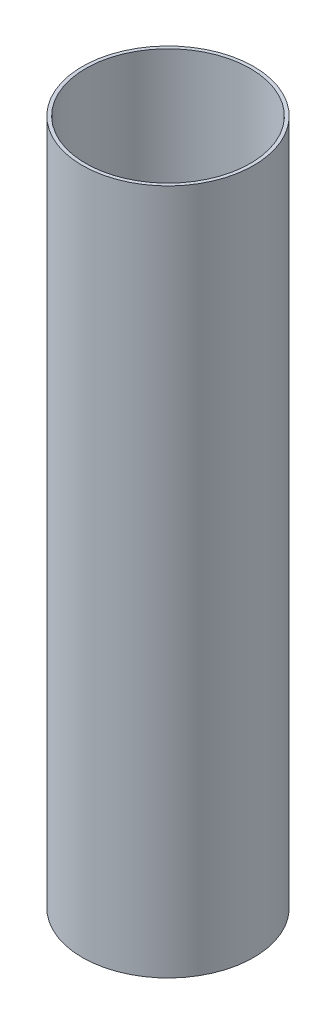
ISO-10303-21;
HEADER;
FILE_DESCRIPTION(('STEP AP214'),'2;1');
FILE_NAME('part.step','',(''),(''),'','','');
FILE_SCHEMA(('AUTOMOTIVE_DESIGN { 1 0 10303 214 1 1 1 1 }'));
ENDSEC;
DATA;
#1=APPLICATION_CONTEXT('core data for automotive mechanical design processes');
#2=APPLICATION_PROTOCOL_DEFINITION('international standard','automotive_design',2000,#1);
#3=PRODUCT_CONTEXT('',#1,'mechanical');
#4=PRODUCT('Part','Part','',(#3));
#5=PRODUCT_RELATED_PRODUCT_CATEGORY('part','',(#4));
#6=PRODUCT_DEFINITION_FORMATION('','',#4);
#7=PRODUCT_DEFINITION_CONTEXT('part definition',#1,'design');
#8=PRODUCT_DEFINITION('design','',#6,#7);
#9=PRODUCT_DEFINITION_SHAPE('','',#8);
#10=(LENGTH_UNIT() NAMED_UNIT(*) SI_UNIT(.MILLI.,.METRE.));
#11=(NAMED_UNIT(*) PLANE_ANGLE_UNIT() SI_UNIT($,.RADIAN.));
#12=(NAMED_UNIT(*) SI_UNIT($,.STERADIAN.) SOLID_ANGLE_UNIT());
#13=UNCERTAINTY_MEASURE_WITH_UNIT(LENGTH_MEASURE(1.E-05),#10,'distance_accuracy_value','');
#14=(GEOMETRIC_REPRESENTATION_CONTEXT(3) GLOBAL_UNCERTAINTY_ASSIGNED_CONTEXT((#13)) GLOBAL_UNIT_ASSIGNED_CONTEXT((#10,
#11,#12)) REPRESENTATION_CONTEXT('',''));
#15=CARTESIAN_POINT('',(0.,0.,0.));
#16=DIRECTION('',(0.,0.,1.));
#17=DIRECTION('',(1.,0.,0.));
#18=AXIS2_PLACEMENT_3D('',#15,#16,#17);
#19=CARTESIAN_POINT('',(0.,158.75,0.));
#20=DIRECTION('',(0.,1.,0.));
#21=DIRECTION('',(0.,0.,1.));
#22=AXIS2_PLACEMENT_3D('',#19,#20,#21);
#23=PLANE('',#22);
#24=CARTESIAN_POINT('',(0.,158.75,0.));
#25=DIRECTION('',(0.,1.,0.));
#26=DIRECTION('',(0.,0.,1.));
#27=AXIS2_PLACEMENT_3D('',#24,#25,#26);
#28=CIRCLE('',#27,39.6748);
#29=CARTESIAN_POINT('',(0.,158.75,-39.6748));
#30=VERTEX_POINT('',#29);
#31=EDGE_CURVE('E10',#30,#30,#28,.T.);
#32=ORIENTED_EDGE('',*,*,#31,.T.);
#33=EDGE_LOOP('',(#32));
#34=FACE_BOUND('',#33,.T.);
#35=CARTESIAN_POINT('',(0.,158.75,0.));
#36=DIRECTION('',(0.,1.,0.));
#37=DIRECTION('',(0.,0.,1.));
#38=AXIS2_PLACEMENT_3D('',#35,#36,#37);
#39=CIRCLE('',#38,38.1);
#40=CARTESIAN_POINT('',(0.,158.75,-38.1));
#41=VERTEX_POINT('',#40);
#42=EDGE_CURVE('E54',#41,#41,#39,.T.);
#43=ORIENTED_EDGE('',*,*,#42,.F.);
#44=EDGE_LOOP('',(#43));
#45=FACE_BOUND('',#44,.T.);
#46=ADVANCED_FACE('F41',(#34,#45),#23,.T.);
#47=CARTESIAN_POINT('',(0.,-158.75,0.));
#48=DIRECTION('',(0.,1.,0.));
#49=DIRECTION('',(0.,0.,1.));
#50=AXIS2_PLACEMENT_3D('',#47,#48,#49);
#51=PLANE('',#50);
#52=CARTESIAN_POINT('',(0.,-158.75,0.));
#53=DIRECTION('',(0.,1.,0.));
#54=DIRECTION('',(0.,0.,1.));
#55=AXIS2_PLACEMENT_3D('',#52,#53,#54);
#56=CIRCLE('',#55,39.6748);
#57=CARTESIAN_POINT('',(0.,-158.75,-39.6748));
#58=VERTEX_POINT('',#57);
#59=EDGE_CURVE('E45',#58,#58,#56,.T.);
#60=ORIENTED_EDGE('',*,*,#59,.F.);
#61=EDGE_LOOP('',(#60));
#62=FACE_BOUND('',#61,.T.);
#63=CARTESIAN_POINT('',(0.,-158.75,0.));
#64=DIRECTION('',(0.,1.,0.));
#65=DIRECTION('',(0.,0.,1.));
#66=AXIS2_PLACEMENT_3D('',#63,#64,#65);
#67=CIRCLE('',#66,38.1);
#68=CARTESIAN_POINT('',(0.,-158.75,-38.1));
#69=VERTEX_POINT('',#68);
#70=EDGE_CURVE('E56',#69,#69,#67,.T.);
#71=ORIENTED_EDGE('',*,*,#70,.T.);
#72=EDGE_LOOP('',(#71));
#73=FACE_BOUND('',#72,.T.);
#74=ADVANCED_FACE('F68',(#62,#73),#51,.F.);
#75=CARTESIAN_POINT('',(0.,158.75,0.));
#76=DIRECTION('',(0.,-1.,0.));
#77=DIRECTION('',(0.,0.,-1.));
#78=AXIS2_PLACEMENT_3D('',#75,#76,#77);
#79=CYLINDRICAL_SURFACE('',#78,39.6748);
#80=CARTESIAN_POINT('',(0.,158.75,-39.6748));
#81=CARTESIAN_POINT('',(0.,155.442708333333,-39.6748));
#82=CARTESIAN_POINT('',(0.,152.135416666667,-39.6748));
#83=CARTESIAN_POINT('',(0.,145.520833333333,-39.6748));
#84=CARTESIAN_POINT('',(0.,142.213541666667,-39.6748));
#85=CARTESIAN_POINT('',(0.,135.598958333333,-39.6748));
#86=CARTESIAN_POINT('',(0.,132.291666666667,-39.6748));
#87=CARTESIAN_POINT('',(0.,125.677083333333,-39.6748));
#88=CARTESIAN_POINT('',(0.,122.369791666667,-39.6748));
#89=CARTESIAN_POINT('',(0.,115.755208333333,-39.6748));
#90=CARTESIAN_POINT('',(0.,112.447916666667,-39.6748));
#91=CARTESIAN_POINT('',(0.,105.833333333333,-39.6748));
#92=CARTESIAN_POINT('',(0.,102.526041666667,-39.6748));
#93=CARTESIAN_POINT('',(0.,95.9114583333333,-39.6748));
#94=CARTESIAN_POINT('',(0.,92.6041666666666,-39.6748));
#95=CARTESIAN_POINT('',(0.,85.9895833333333,-39.6748));
#96=CARTESIAN_POINT('',(0.,82.6822916666666,-39.6748));
#97=CARTESIAN_POINT('',(0.,76.0677083333333,-39.6748));
#98=CARTESIAN_POINT('',(0.,72.7604166666666,-39.6748));
#99=CARTESIAN_POINT('',(0.,66.1458333333333,-39.6748));
#100=CARTESIAN_POINT('',(0.,62.8385416666666,-39.6748));
#101=CARTESIAN_POINT('',(0.,56.2239583333333,-39.6748));
#102=CARTESIAN_POINT('',(0.,52.9166666666666,-39.6748));
#103=CARTESIAN_POINT('',(0.,46.3020833333333,-39.6748));
#104=CARTESIAN_POINT('',(0.,42.9947916666666,-39.6748));
#105=CARTESIAN_POINT('',(0.,36.3802083333333,-39.6748));
#106=CARTESIAN_POINT('',(0.,33.0729166666666,-39.6748));
#107=CARTESIAN_POINT('',(0.,26.4583333333333,-39.6748));
#108=CARTESIAN_POINT('',(0.,23.1510416666666,-39.6748));
#109=CARTESIAN_POINT('',(0.,16.5364583333333,-39.6748));
#110=CARTESIAN_POINT('',(0.,13.2291666666666,-39.6748));
#111=CARTESIAN_POINT('',(0.,6.6145833333333,-39.6748));
#112=CARTESIAN_POINT('',(0.,3.30729166666664,-39.6748));
#113=CARTESIAN_POINT('',(0.,-3.30729166666669,-39.6748));
#114=CARTESIAN_POINT('',(0.,-6.61458333333336,-39.6748));
#115=CARTESIAN_POINT('',(0.,-13.2291666666667,-39.6748));
#116=CARTESIAN_POINT('',(0.,-16.5364583333334,-39.6748));
#117=CARTESIAN_POINT('',(0.,-23.1510416666667,-39.6748));
#118=CARTESIAN_POINT('',(0.,-26.4583333333334,-39.6748));
#119=CARTESIAN_POINT('',(0.,-33.0729166666667,-39.6748));
#120=CARTESIAN_POINT('',(0.,-36.3802083333334,-39.6748));
#121=CARTESIAN_POINT('',(0.,-42.9947916666667,-39.6748));
#122=CARTESIAN_POINT('',(0.,-46.3020833333334,-39.6748));
#123=CARTESIAN_POINT('',(0.,-52.9166666666667,-39.6748));
#124=CARTESIAN_POINT('',(0.,-56.2239583333334,-39.6748));
#125=CARTESIAN_POINT('',(0.,-62.8385416666667,-39.6748));
#126=CARTESIAN_POINT('',(0.,-66.1458333333334,-39.6748));
#127=CARTESIAN_POINT('',(0.,-72.7604166666667,-39.6748));
#128=CARTESIAN_POINT('',(0.,-76.0677083333334,-39.6748));
#129=CARTESIAN_POINT('',(0.,-82.6822916666667,-39.6748));
#130=CARTESIAN_POINT('',(0.,-85.9895833333334,-39.6748));
#131=CARTESIAN_POINT('',(0.,-92.6041666666667,-39.6748));
#132=CARTESIAN_POINT('',(0.,-95.9114583333334,-39.6748));
#133=CARTESIAN_POINT('',(0.,-102.526041666667,-39.6748));
#134=CARTESIAN_POINT('',(0.,-105.833333333333,-39.6748));
#135=CARTESIAN_POINT('',(0.,-112.447916666667,-39.6748));
#136=CARTESIAN_POINT('',(0.,-115.755208333333,-39.6748));
#137=CARTESIAN_POINT('',(0.,-122.369791666667,-39.6748));
#138=CARTESIAN_POINT('',(0.,-125.677083333333,-39.6748));
#139=CARTESIAN_POINT('',(0.,-132.291666666667,-39.6748));
#140=CARTESIAN_POINT('',(0.,-135.598958333333,-39.6748));
#141=CARTESIAN_POINT('',(0.,-142.213541666667,-39.6748));
#142=CARTESIAN_POINT('',(0.,-145.520833333333,-39.6748));
#143=CARTESIAN_POINT('',(0.,-152.135416666667,-39.6748));
#144=CARTESIAN_POINT('',(0.,-155.442708333333,-39.6748));
#145=CARTESIAN_POINT('',(0.,-158.75,-39.6748));
#146=B_SPLINE_CURVE_WITH_KNOTS('',3,(#80,#81,#82,#83,#84,#85,#86,#87,#88,#89,#90,#91,#92,#93,
#94,#95,#96,#97,#98,#99,#100,#101,#102,#103,#104,#105,#106,#107,#108,#109,#110,#111,#112,#113,
#114,#115,#116,#117,#118,#119,#120,#121,#122,#123,#124,#125,#126,#127,#128,#129,#130,#131,#132,
#133,#134,#135,#136,#137,#138,#139,#140,#141,#142,#143,#144,#145),.UNSPECIFIED.,.F.,.F.,(4,2,2,
2,2,2,2,2,2,2,2,2,2,2,2,2,2,2,2,2,2,2,2,2,2,2,2,2,2,2,2,2,4),(0.,9.92187500000002,19.84375,
29.765625,39.6875,49.609375,59.53125,69.453125,79.375,89.296875,99.21875,109.140625,119.0625,
128.984375,138.90625,148.828125,158.75,168.671875,178.59375,188.515625,198.4375,208.359375,
218.28125,228.203125,238.125,248.046875,257.96875,267.890625,277.8125,287.734375,297.65625,
307.578125,317.5),.UNSPECIFIED.);
#147=EDGE_CURVE('BSEAM43',#30,#58,#146,.T.);
#148=ORIENTED_EDGE('',*,*,#31,.F.);
#149=ORIENTED_EDGE('',*,*,#59,.T.);
#150=ORIENTED_EDGE('',*,*,#147,.T.);
#151=ORIENTED_EDGE('',*,*,#147,.F.);
#152=EDGE_LOOP('',(#148,#150,#149,#151));
#153=FACE_BOUND('',#152,.T.);
#154=ADVANCED_FACE('F43',(#153),#79,.T.);
#155=CARTESIAN_POINT('',(0.,158.75,0.));
#156=DIRECTION('',(0.,-1.,0.));
#157=DIRECTION('',(0.,0.,-1.));
#158=AXIS2_PLACEMENT_3D('',#155,#156,#157);
#159=CYLINDRICAL_SURFACE('',#158,38.1);
#160=CARTESIAN_POINT('',(0.,158.75,-38.1));
#161=CARTESIAN_POINT('',(0.,155.442708333333,-38.1));
#162=CARTESIAN_POINT('',(0.,152.135416666667,-38.1));
#163=CARTESIAN_POINT('',(0.,145.520833333333,-38.1));
#164=CARTESIAN_POINT('',(0.,142.213541666667,-38.1));
#165=CARTESIAN_POINT('',(0.,135.598958333333,-38.1));
#166=CARTESIAN_POINT('',(0.,132.291666666667,-38.1));
#167=CARTESIAN_POINT('',(0.,125.677083333333,-38.1));
#168=CARTESIAN_POINT('',(0.,122.369791666667,-38.1));
#169=CARTESIAN_POINT('',(0.,115.755208333333,-38.1));
#170=CARTESIAN_POINT('',(0.,112.447916666667,-38.1));
#171=CARTESIAN_POINT('',(0.,105.833333333333,-38.1));
#172=CARTESIAN_POINT('',(0.,102.526041666667,-38.1));
#173=CARTESIAN_POINT('',(0.,95.9114583333333,-38.1));
#174=CARTESIAN_POINT('',(0.,92.6041666666666,-38.1));
#175=CARTESIAN_POINT('',(0.,85.9895833333333,-38.1));
#176=CARTESIAN_POINT('',(0.,82.6822916666666,-38.1));
#177=CARTESIAN_POINT('',(0.,76.0677083333333,-38.1));
#178=CARTESIAN_POINT('',(0.,72.7604166666666,-38.1));
#179=CARTESIAN_POINT('',(0.,66.1458333333333,-38.1));
#180=CARTESIAN_POINT('',(0.,62.8385416666666,-38.1));
#181=CARTESIAN_POINT('',(0.,56.2239583333333,-38.1));
#182=CARTESIAN_POINT('',(0.,52.9166666666666,-38.1));
#183=CARTESIAN_POINT('',(0.,46.3020833333333,-38.1));
#184=CARTESIAN_POINT('',(0.,42.9947916666666,-38.1));
#185=CARTESIAN_POINT('',(0.,36.3802083333333,-38.1));
#186=CARTESIAN_POINT('',(0.,33.0729166666666,-38.1));
#187=CARTESIAN_POINT('',(0.,26.4583333333333,-38.1));
#188=CARTESIAN_POINT('',(0.,23.1510416666666,-38.1));
#189=CARTESIAN_POINT('',(0.,16.5364583333333,-38.1));
#190=CARTESIAN_POINT('',(0.,13.2291666666666,-38.1));
#191=CARTESIAN_POINT('',(0.,6.6145833333333,-38.1));
#192=CARTESIAN_POINT('',(0.,3.30729166666664,-38.1));
#193=CARTESIAN_POINT('',(0.,-3.30729166666669,-38.1));
#194=CARTESIAN_POINT('',(0.,-6.61458333333336,-38.1));
#195=CARTESIAN_POINT('',(0.,-13.2291666666667,-38.1));
#196=CARTESIAN_POINT('',(0.,-16.5364583333334,-38.1));
#197=CARTESIAN_POINT('',(0.,-23.1510416666667,-38.1));
#198=CARTESIAN_POINT('',(0.,-26.4583333333334,-38.1));
#199=CARTESIAN_POINT('',(0.,-33.0729166666667,-38.1));
#200=CARTESIAN_POINT('',(0.,-36.3802083333334,-38.1));
#201=CARTESIAN_POINT('',(0.,-42.9947916666667,-38.1));
#202=CARTESIAN_POINT('',(0.,-46.3020833333334,-38.1));
#203=CARTESIAN_POINT('',(0.,-52.9166666666667,-38.1));
#204=CARTESIAN_POINT('',(0.,-56.2239583333334,-38.1));
#205=CARTESIAN_POINT('',(0.,-62.8385416666667,-38.1));
#206=CARTESIAN_POINT('',(0.,-66.1458333333334,-38.1));
#207=CARTESIAN_POINT('',(0.,-72.7604166666667,-38.1));
#208=CARTESIAN_POINT('',(0.,-76.0677083333334,-38.1));
#209=CARTESIAN_POINT('',(0.,-82.6822916666667,-38.1));
#210=CARTESIAN_POINT('',(0.,-85.9895833333334,-38.1));
#211=CARTESIAN_POINT('',(0.,-92.6041666666667,-38.1));
#212=CARTESIAN_POINT('',(0.,-95.9114583333334,-38.1));
#213=CARTESIAN_POINT('',(0.,-102.526041666667,-38.1));
#214=CARTESIAN_POINT('',(0.,-105.833333333333,-38.1));
#215=CARTESIAN_POINT('',(0.,-112.447916666667,-38.1));
#216=CARTESIAN_POINT('',(0.,-115.755208333333,-38.1));
#217=CARTESIAN_POINT('',(0.,-122.369791666667,-38.1));
#218=CARTESIAN_POINT('',(0.,-125.677083333333,-38.1));
#219=CARTESIAN_POINT('',(0.,-132.291666666667,-38.1));
#220=CARTESIAN_POINT('',(0.,-135.598958333333,-38.1));
#221=CARTESIAN_POINT('',(0.,-142.213541666667,-38.1));
#222=CARTESIAN_POINT('',(0.,-145.520833333333,-38.1));
#223=CARTESIAN_POINT('',(0.,-152.135416666667,-38.1));
#224=CARTESIAN_POINT('',(0.,-155.442708333333,-38.1));
#225=CARTESIAN_POINT('',(0.,-158.75,-38.1));
#226=B_SPLINE_CURVE_WITH_KNOTS('',3,(#160,#161,#162,#163,#164,#165,#166,#167,#168,#169,#170,
#171,#172,#173,#174,#175,#176,#177,#178,#179,#180,#181,#182,#183,#184,#185,#186,#187,#188,#189,
#190,#191,#192,#193,#194,#195,#196,#197,#198,#199,#200,#201,#202,#203,#204,#205,#206,#207,#208,
#209,#210,#211,#212,#213,#214,#215,#216,#217,#218,#219,#220,#221,#222,#223,#224,#225),
.UNSPECIFIED.,.F.,.F.,(4,2,2,2,2,2,2,2,2,2,2,2,2,2,2,2,2,2,2,2,2,2,2,2,2,2,2,2,2,2,2,2,4),(0.,
9.92187500000002,19.84375,29.765625,39.6875,49.609375,59.53125,69.453125,79.375,89.296875,
99.21875,109.140625,119.0625,128.984375,138.90625,148.828125,158.75,168.671875,178.59375,
188.515625,198.4375,208.359375,218.28125,228.203125,238.125,248.046875,257.96875,267.890625,
277.8125,287.734375,297.65625,307.578125,317.5),.UNSPECIFIED.);
#227=EDGE_CURVE('BSEAM64',#41,#69,#226,.T.);
#228=ORIENTED_EDGE('',*,*,#42,.T.);
#229=ORIENTED_EDGE('',*,*,#70,.F.);
#230=ORIENTED_EDGE('',*,*,#227,.T.);
#231=ORIENTED_EDGE('',*,*,#227,.F.);
#232=EDGE_LOOP('',(#228,#230,#229,#231));
#233=FACE_BOUND('',#232,.T.);
#234=ADVANCED_FACE('F64',(#233),#159,.F.);
#235=CLOSED_SHELL('',(#46,#74,#154,#234));
#236=MANIFOLD_SOLID_BREP('B2',#235);
#237=ADVANCED_BREP_SHAPE_REPRESENTATION('',(#18,#236),#14);
#238=SHAPE_DEFINITION_REPRESENTATION(#9,#237);
ENDSEC;
END-ISO-10303-21;
